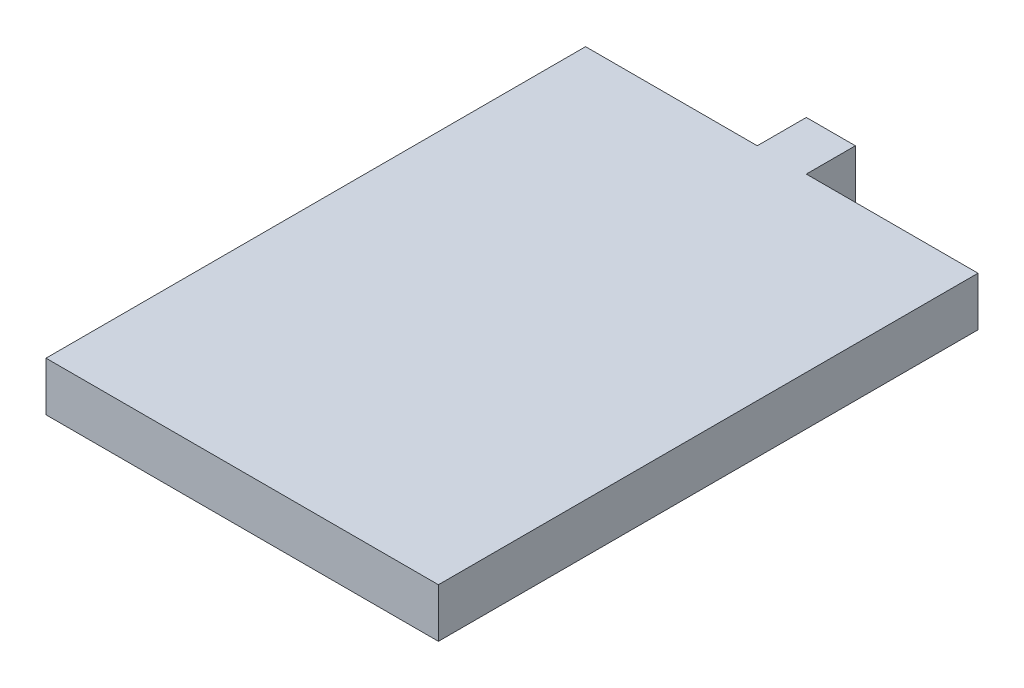
ISO-10303-21;
HEADER;
FILE_DESCRIPTION(('STEP AP214'),'2;1');
FILE_NAME('part.step','',(''),(''),'','','');
FILE_SCHEMA(('AUTOMOTIVE_DESIGN { 1 0 10303 214 1 1 1 1 }'));
ENDSEC;
DATA;
#1=APPLICATION_CONTEXT('core data for automotive mechanical design processes');
#2=APPLICATION_PROTOCOL_DEFINITION('international standard','automotive_design',2000,#1);
#3=PRODUCT_CONTEXT('',#1,'mechanical');
#4=PRODUCT('Part','Part','',(#3));
#5=PRODUCT_RELATED_PRODUCT_CATEGORY('part','',(#4));
#6=PRODUCT_DEFINITION_FORMATION('','',#4);
#7=PRODUCT_DEFINITION_CONTEXT('part definition',#1,'design');
#8=PRODUCT_DEFINITION('design','',#6,#7);
#9=PRODUCT_DEFINITION_SHAPE('','',#8);
#10=(LENGTH_UNIT() NAMED_UNIT(*) SI_UNIT(.MILLI.,.METRE.));
#11=(NAMED_UNIT(*) PLANE_ANGLE_UNIT() SI_UNIT($,.RADIAN.));
#12=(NAMED_UNIT(*) SI_UNIT($,.STERADIAN.) SOLID_ANGLE_UNIT());
#13=UNCERTAINTY_MEASURE_WITH_UNIT(LENGTH_MEASURE(1.E-05),#10,'distance_accuracy_value','');
#14=(GEOMETRIC_REPRESENTATION_CONTEXT(3) GLOBAL_UNCERTAINTY_ASSIGNED_CONTEXT((#13)) GLOBAL_UNIT_ASSIGNED_CONTEXT((#10,
#11,#12)) REPRESENTATION_CONTEXT('',''));
#15=CARTESIAN_POINT('',(0.,0.,0.));
#16=DIRECTION('',(0.,0.,1.));
#17=DIRECTION('',(1.,0.,0.));
#18=AXIS2_PLACEMENT_3D('',#15,#16,#17);
#19=CARTESIAN_POINT('',(0.,3.175,-34.925));
#20=DIRECTION('',(0.,0.,-1.));
#21=DIRECTION('',(-1.,0.,0.));
#22=AXIS2_PLACEMENT_3D('',#19,#20,#21);
#23=PLANE('',#22);
#24=DIRECTION('',(1.,0.,0.));
#25=VECTOR('',#24,1.);
#26=CARTESIAN_POINT('',(0.,0.,-34.925));
#27=LINE('',#26,#25);
#28=CARTESIAN_POINT('',(14.2875,0.,-34.925));
#29=VERTEX_POINT('',#28);
#30=CARTESIAN_POINT('',(25.4,0.,-34.925));
#31=VERTEX_POINT('',#30);
#32=EDGE_CURVE('E130',#29,#31,#27,.T.);
#33=ORIENTED_EDGE('',*,*,#32,.F.);
#34=DIRECTION('',(0.,-1.,0.));
#35=VECTOR('',#34,1.);
#36=CARTESIAN_POINT('',(14.2875,3.175,-34.925));
#37=LINE('',#36,#35);
#38=CARTESIAN_POINT('',(14.2875,3.175,-34.925));
#39=VERTEX_POINT('',#38);
#40=EDGE_CURVE('E11',#39,#29,#37,.T.);
#41=ORIENTED_EDGE('',*,*,#40,.F.);
#42=DIRECTION('',(1.,0.,0.));
#43=VECTOR('',#42,1.);
#44=CARTESIAN_POINT('',(0.,3.175,-34.925));
#45=LINE('',#44,#43);
#46=CARTESIAN_POINT('',(25.4,3.175,-34.925));
#47=VERTEX_POINT('',#46);
#48=EDGE_CURVE('E149',#39,#47,#45,.T.);
#49=ORIENTED_EDGE('',*,*,#48,.T.);
#50=DIRECTION('',(0.,-1.,0.));
#51=VECTOR('',#50,1.);
#52=CARTESIAN_POINT('',(25.4,3.175,-34.925));
#53=LINE('',#52,#51);
#54=EDGE_CURVE('E87',#47,#31,#53,.T.);
#55=ORIENTED_EDGE('',*,*,#54,.T.);
#56=EDGE_LOOP('',(#33,#41,#49,#55));
#57=FACE_BOUND('',#56,.T.);
#58=ADVANCED_FACE('F37',(#57),#23,.T.);
#59=CARTESIAN_POINT('',(14.2875,3.175,0.));
#60=DIRECTION('',(1.,0.,0.));
#61=DIRECTION('',(0.,0.,-1.));
#62=AXIS2_PLACEMENT_3D('',#59,#60,#61);
#63=PLANE('',#62);
#64=DIRECTION('',(0.,0.,1.));
#65=VECTOR('',#64,1.);
#66=CARTESIAN_POINT('',(14.2875,0.,0.));
#67=LINE('',#66,#65);
#68=CARTESIAN_POINT('',(14.2875,0.,-38.1));
#69=VERTEX_POINT('',#68);
#70=EDGE_CURVE('E133',#69,#29,#67,.T.);
#71=ORIENTED_EDGE('',*,*,#70,.F.);
#72=DIRECTION('',(0.,-1.,0.));
#73=VECTOR('',#72,1.);
#74=CARTESIAN_POINT('',(14.2875,3.175,-38.1));
#75=LINE('',#74,#73);
#76=CARTESIAN_POINT('',(14.2875,3.175,-38.1));
#77=VERTEX_POINT('',#76);
#78=EDGE_CURVE('E45',#77,#69,#75,.T.);
#79=ORIENTED_EDGE('',*,*,#78,.F.);
#80=DIRECTION('',(0.,0.,1.));
#81=VECTOR('',#80,1.);
#82=CARTESIAN_POINT('',(14.2875,3.175,0.));
#83=LINE('',#82,#81);
#84=EDGE_CURVE('E175',#77,#39,#83,.T.);
#85=ORIENTED_EDGE('',*,*,#84,.T.);
#86=ORIENTED_EDGE('',*,*,#40,.T.);
#87=EDGE_LOOP('',(#71,#79,#85,#86));
#88=FACE_BOUND('',#87,.T.);
#89=ADVANCED_FACE('F166',(#88),#63,.T.);
#90=CARTESIAN_POINT('',(0.,3.175,-38.1));
#91=DIRECTION('',(0.,0.,-1.));
#92=DIRECTION('',(-1.,0.,0.));
#93=AXIS2_PLACEMENT_3D('',#90,#91,#92);
#94=PLANE('',#93);
#95=DIRECTION('',(1.,0.,0.));
#96=VECTOR('',#95,1.);
#97=CARTESIAN_POINT('',(0.,0.,-38.1));
#98=LINE('',#97,#96);
#99=CARTESIAN_POINT('',(11.1125,0.,-38.1));
#100=VERTEX_POINT('',#99);
#101=EDGE_CURVE('E136',#100,#69,#98,.T.);
#102=ORIENTED_EDGE('',*,*,#101,.F.);
#103=DIRECTION('',(0.,-1.,0.));
#104=VECTOR('',#103,1.);
#105=CARTESIAN_POINT('',(11.1125,3.175,-38.1));
#106=LINE('',#105,#104);
#107=CARTESIAN_POINT('',(11.1125,3.175,-38.1));
#108=VERTEX_POINT('',#107);
#109=EDGE_CURVE('E155',#108,#100,#106,.T.);
#110=ORIENTED_EDGE('',*,*,#109,.F.);
#111=DIRECTION('',(1.,0.,0.));
#112=VECTOR('',#111,1.);
#113=CARTESIAN_POINT('',(0.,3.175,-38.1));
#114=LINE('',#113,#112);
#115=EDGE_CURVE('E162',#108,#77,#114,.T.);
#116=ORIENTED_EDGE('',*,*,#115,.T.);
#117=ORIENTED_EDGE('',*,*,#78,.T.);
#118=EDGE_LOOP('',(#102,#110,#116,#117));
#119=FACE_BOUND('',#118,.T.);
#120=ADVANCED_FACE('F160',(#119),#94,.T.);
#121=CARTESIAN_POINT('',(11.1125,3.175,0.));
#122=DIRECTION('',(1.,0.,0.));
#123=DIRECTION('',(0.,0.,-1.));
#124=AXIS2_PLACEMENT_3D('',#121,#122,#123);
#125=PLANE('',#124);
#126=DIRECTION('',(0.,0.,1.));
#127=VECTOR('',#126,1.);
#128=CARTESIAN_POINT('',(11.1125,0.,0.));
#129=LINE('',#128,#127);
#130=CARTESIAN_POINT('',(11.1125,0.,-34.925));
#131=VERTEX_POINT('',#130);
#132=EDGE_CURVE('E139',#100,#131,#129,.T.);
#133=ORIENTED_EDGE('',*,*,#132,.T.);
#134=DIRECTION('',(0.,-1.,0.));
#135=VECTOR('',#134,1.);
#136=CARTESIAN_POINT('',(11.1125,3.175,-34.925));
#137=LINE('',#136,#135);
#138=CARTESIAN_POINT('',(11.1125,3.175,-34.925));
#139=VERTEX_POINT('',#138);
#140=EDGE_CURVE('E153',#139,#131,#137,.T.);
#141=ORIENTED_EDGE('',*,*,#140,.F.);
#142=DIRECTION('',(0.,0.,1.));
#143=VECTOR('',#142,1.);
#144=CARTESIAN_POINT('',(11.1125,3.175,0.));
#145=LINE('',#144,#143);
#146=EDGE_CURVE('E125',#108,#139,#145,.T.);
#147=ORIENTED_EDGE('',*,*,#146,.F.);
#148=ORIENTED_EDGE('',*,*,#109,.T.);
#149=EDGE_LOOP('',(#133,#141,#147,#148));
#150=FACE_BOUND('',#149,.T.);
#151=ADVANCED_FACE('F173',(#150),#125,.F.);
#152=CARTESIAN_POINT('',(0.,3.175,-34.925));
#153=DIRECTION('',(0.,0.,-1.));
#154=DIRECTION('',(-1.,0.,0.));
#155=AXIS2_PLACEMENT_3D('',#152,#153,#154);
#156=PLANE('',#155);
#157=DIRECTION('',(1.,0.,0.));
#158=VECTOR('',#157,1.);
#159=CARTESIAN_POINT('',(0.,0.,-34.925));
#160=LINE('',#159,#158);
#161=CARTESIAN_POINT('',(0.,0.,-34.925));
#162=VERTEX_POINT('',#161);
#163=EDGE_CURVE('E142',#162,#131,#160,.T.);
#164=ORIENTED_EDGE('',*,*,#163,.F.);
#165=DIRECTION('',(0.,-1.,0.));
#166=VECTOR('',#165,1.);
#167=CARTESIAN_POINT('',(0.,3.175,-34.925));
#168=LINE('',#167,#166);
#169=CARTESIAN_POINT('',(0.,3.175,-34.925));
#170=VERTEX_POINT('',#169);
#171=EDGE_CURVE('E114',#170,#162,#168,.T.);
#172=ORIENTED_EDGE('',*,*,#171,.F.);
#173=DIRECTION('',(1.,0.,0.));
#174=VECTOR('',#173,1.);
#175=CARTESIAN_POINT('',(0.,3.175,-34.925));
#176=LINE('',#175,#174);
#177=EDGE_CURVE('E123',#170,#139,#176,.T.);
#178=ORIENTED_EDGE('',*,*,#177,.T.);
#179=ORIENTED_EDGE('',*,*,#140,.T.);
#180=EDGE_LOOP('',(#164,#172,#178,#179));
#181=FACE_BOUND('',#180,.T.);
#182=ADVANCED_FACE('F190',(#181),#156,.T.);
#183=CARTESIAN_POINT('',(0.,3.175,0.));
#184=DIRECTION('',(-1.,0.,0.));
#185=DIRECTION('',(0.,0.,1.));
#186=AXIS2_PLACEMENT_3D('',#183,#184,#185);
#187=PLANE('',#186);
#188=DIRECTION('',(0.,0.,-1.));
#189=VECTOR('',#188,1.);
#190=CARTESIAN_POINT('',(0.,0.,0.));
#191=LINE('',#190,#189);
#192=CARTESIAN_POINT('',(0.,0.,0.));
#193=VERTEX_POINT('',#192);
#194=EDGE_CURVE('E113',#193,#162,#191,.T.);
#195=ORIENTED_EDGE('',*,*,#194,.F.);
#196=DIRECTION('',(0.,-1.,0.));
#197=VECTOR('',#196,1.);
#198=CARTESIAN_POINT('',(0.,3.175,0.));
#199=LINE('',#198,#197);
#200=CARTESIAN_POINT('',(0.,3.175,0.));
#201=VERTEX_POINT('',#200);
#202=EDGE_CURVE('E107',#201,#193,#199,.T.);
#203=ORIENTED_EDGE('',*,*,#202,.F.);
#204=DIRECTION('',(0.,0.,-1.));
#205=VECTOR('',#204,1.);
#206=CARTESIAN_POINT('',(0.,3.175,0.));
#207=LINE('',#206,#205);
#208=EDGE_CURVE('E111',#201,#170,#207,.T.);
#209=ORIENTED_EDGE('',*,*,#208,.T.);
#210=ORIENTED_EDGE('',*,*,#171,.T.);
#211=EDGE_LOOP('',(#195,#203,#209,#210));
#212=FACE_BOUND('',#211,.T.);
#213=ADVANCED_FACE('F109',(#212),#187,.T.);
#214=CARTESIAN_POINT('',(0.,3.175,0.));
#215=DIRECTION('',(0.,0.,-1.));
#216=DIRECTION('',(-1.,0.,0.));
#217=AXIS2_PLACEMENT_3D('',#214,#215,#216);
#218=PLANE('',#217);
#219=DIRECTION('',(1.,0.,0.));
#220=VECTOR('',#219,1.);
#221=CARTESIAN_POINT('',(0.,0.,0.));
#222=LINE('',#221,#220);
#223=CARTESIAN_POINT('',(25.4,0.,0.));
#224=VERTEX_POINT('',#223);
#225=EDGE_CURVE('E80',#193,#224,#222,.T.);
#226=ORIENTED_EDGE('',*,*,#225,.T.);
#227=DIRECTION('',(0.,-1.,0.));
#228=VECTOR('',#227,1.);
#229=CARTESIAN_POINT('',(25.4,3.175,0.));
#230=LINE('',#229,#228);
#231=CARTESIAN_POINT('',(25.4,3.175,0.));
#232=VERTEX_POINT('',#231);
#233=EDGE_CURVE('E115',#232,#224,#230,.T.);
#234=ORIENTED_EDGE('',*,*,#233,.F.);
#235=DIRECTION('',(1.,0.,0.));
#236=VECTOR('',#235,1.);
#237=CARTESIAN_POINT('',(0.,3.175,0.));
#238=LINE('',#237,#236);
#239=EDGE_CURVE('E117',#201,#232,#238,.T.);
#240=ORIENTED_EDGE('',*,*,#239,.F.);
#241=ORIENTED_EDGE('',*,*,#202,.T.);
#242=EDGE_LOOP('',(#226,#234,#240,#241));
#243=FACE_BOUND('',#242,.T.);
#244=ADVANCED_FACE('F118',(#243),#218,.F.);
#245=CARTESIAN_POINT('',(25.4,3.175,0.));
#246=DIRECTION('',(-1.,0.,0.));
#247=DIRECTION('',(0.,0.,1.));
#248=AXIS2_PLACEMENT_3D('',#245,#246,#247);
#249=PLANE('',#248);
#250=DIRECTION('',(0.,0.,-1.));
#251=VECTOR('',#250,1.);
#252=CARTESIAN_POINT('',(25.4,0.,0.));
#253=LINE('',#252,#251);
#254=EDGE_CURVE('E147',#224,#31,#253,.T.);
#255=ORIENTED_EDGE('',*,*,#254,.T.);
#256=ORIENTED_EDGE('',*,*,#54,.F.);
#257=DIRECTION('',(0.,0.,-1.));
#258=VECTOR('',#257,1.);
#259=CARTESIAN_POINT('',(25.4,3.175,0.));
#260=LINE('',#259,#258);
#261=EDGE_CURVE('E53',#232,#47,#260,.T.);
#262=ORIENTED_EDGE('',*,*,#261,.F.);
#263=ORIENTED_EDGE('',*,*,#233,.T.);
#264=EDGE_LOOP('',(#255,#256,#262,#263));
#265=FACE_BOUND('',#264,.T.);
#266=ADVANCED_FACE('F198',(#265),#249,.F.);
#267=CARTESIAN_POINT('',(0.,3.175,0.));
#268=DIRECTION('',(0.,1.,0.));
#269=DIRECTION('',(0.,0.,1.));
#270=AXIS2_PLACEMENT_3D('',#267,#268,#269);
#271=PLANE('',#270);
#272=ORIENTED_EDGE('',*,*,#48,.F.);
#273=ORIENTED_EDGE('',*,*,#84,.F.);
#274=ORIENTED_EDGE('',*,*,#115,.F.);
#275=ORIENTED_EDGE('',*,*,#146,.T.);
#276=ORIENTED_EDGE('',*,*,#177,.F.);
#277=ORIENTED_EDGE('',*,*,#208,.F.);
#278=ORIENTED_EDGE('',*,*,#239,.T.);
#279=ORIENTED_EDGE('',*,*,#261,.T.);
#280=EDGE_LOOP('',(#272,#273,#274,#275,#276,#277,#278,#279));
#281=FACE_BOUND('',#280,.T.);
#282=ADVANCED_FACE('F121',(#281),#271,.T.);
#283=CARTESIAN_POINT('',(0.,0.,0.));
#284=DIRECTION('',(0.,1.,0.));
#285=DIRECTION('',(0.,0.,1.));
#286=AXIS2_PLACEMENT_3D('',#283,#284,#285);
#287=PLANE('',#286);
#288=ORIENTED_EDGE('',*,*,#32,.T.);
#289=ORIENTED_EDGE('',*,*,#254,.F.);
#290=ORIENTED_EDGE('',*,*,#225,.F.);
#291=ORIENTED_EDGE('',*,*,#194,.T.);
#292=ORIENTED_EDGE('',*,*,#163,.T.);
#293=ORIENTED_EDGE('',*,*,#132,.F.);
#294=ORIENTED_EDGE('',*,*,#101,.T.);
#295=ORIENTED_EDGE('',*,*,#70,.T.);
#296=EDGE_LOOP('',(#288,#289,#290,#291,#292,#293,#294,#295));
#297=FACE_BOUND('',#296,.T.);
#298=ADVANCED_FACE('F169',(#297),#287,.F.);
#299=CLOSED_SHELL('',(#58,#89,#120,#151,#182,#213,#244,#266,#282,#298));
#300=MANIFOLD_SOLID_BREP('B2',#299);
#301=ADVANCED_BREP_SHAPE_REPRESENTATION('',(#18,#300),#14);
#302=SHAPE_DEFINITION_REPRESENTATION(#9,#301);
ENDSEC;
END-ISO-10303-21;
